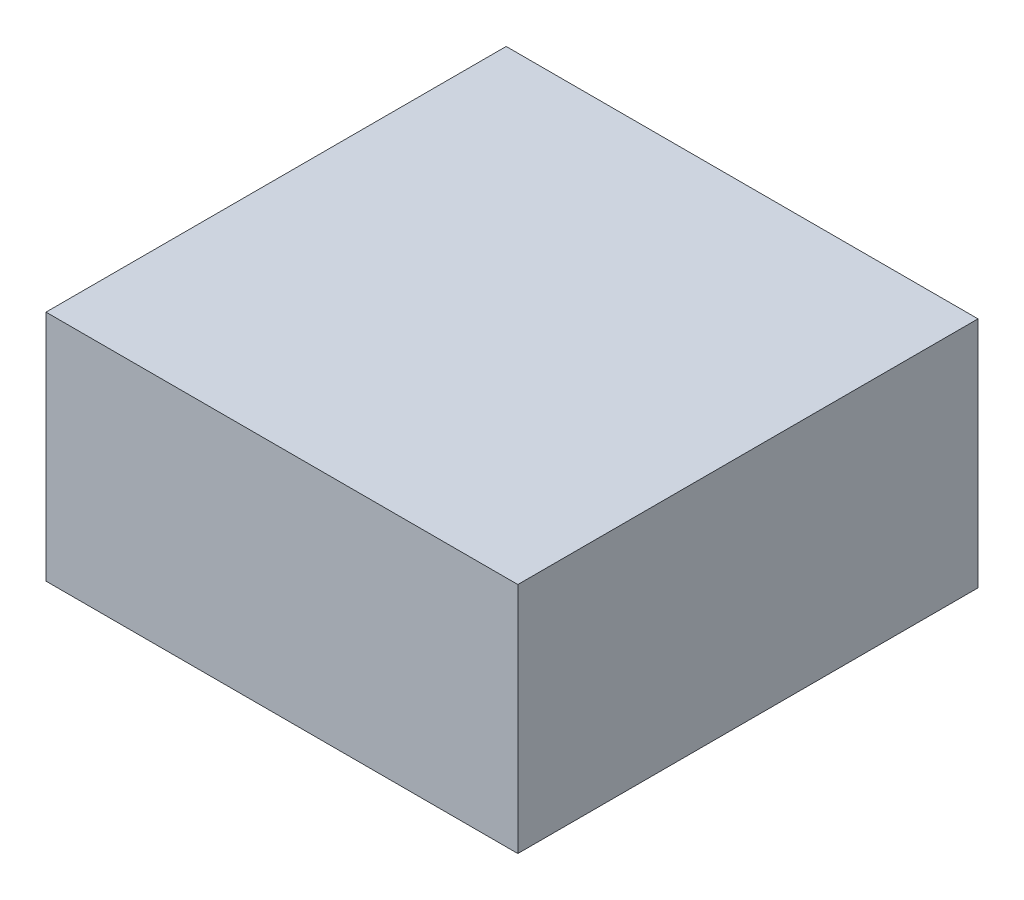
ISO-10303-21;
HEADER;
FILE_DESCRIPTION(('STEP AP214'),'2;1');
FILE_NAME('part.step','',(''),(''),'','','');
FILE_SCHEMA(('AUTOMOTIVE_DESIGN { 1 0 10303 214 1 1 1 1 }'));
ENDSEC;
DATA;
#1=APPLICATION_CONTEXT('core data for automotive mechanical design processes');
#2=APPLICATION_PROTOCOL_DEFINITION('international standard','automotive_design',2000,#1);
#3=PRODUCT_CONTEXT('',#1,'mechanical');
#4=PRODUCT('Part','Part','',(#3));
#5=PRODUCT_RELATED_PRODUCT_CATEGORY('part','',(#4));
#6=PRODUCT_DEFINITION_FORMATION('','',#4);
#7=PRODUCT_DEFINITION_CONTEXT('part definition',#1,'design');
#8=PRODUCT_DEFINITION('design','',#6,#7);
#9=PRODUCT_DEFINITION_SHAPE('','',#8);
#10=(LENGTH_UNIT() NAMED_UNIT(*) SI_UNIT(.MILLI.,.METRE.));
#11=(NAMED_UNIT(*) PLANE_ANGLE_UNIT() SI_UNIT($,.RADIAN.));
#12=(NAMED_UNIT(*) SI_UNIT($,.STERADIAN.) SOLID_ANGLE_UNIT());
#13=UNCERTAINTY_MEASURE_WITH_UNIT(LENGTH_MEASURE(1.E-05),#10,'distance_accuracy_value','');
#14=(GEOMETRIC_REPRESENTATION_CONTEXT(3) GLOBAL_UNCERTAINTY_ASSIGNED_CONTEXT((#13)) GLOBAL_UNIT_ASSIGNED_CONTEXT((#10,
#11,#12)) REPRESENTATION_CONTEXT('',''));
#15=CARTESIAN_POINT('',(0.,0.,0.));
#16=DIRECTION('',(0.,0.,1.));
#17=DIRECTION('',(1.,0.,0.));
#18=AXIS2_PLACEMENT_3D('',#15,#16,#17);
#19=CARTESIAN_POINT('',(-10.,-10.,39.5));
#20=DIRECTION('',(1.,0.,0.));
#21=DIRECTION('',(0.,0.,-1.));
#22=AXIS2_PLACEMENT_3D('',#19,#20,#21);
#23=PLANE('',#22);
#24=DIRECTION('',(0.,-1.,0.));
#25=VECTOR('',#24,1.);
#26=CARTESIAN_POINT('',(-10.,-10.,0.));
#27=LINE('',#26,#25);
#28=CARTESIAN_POINT('',(-10.,10.,0.));
#29=VERTEX_POINT('',#28);
#30=CARTESIAN_POINT('',(-10.,-10.,0.));
#31=VERTEX_POINT('',#30);
#32=EDGE_CURVE('E113',#29,#31,#27,.T.);
#33=ORIENTED_EDGE('',*,*,#32,.T.);
#34=DIRECTION('',(0.,0.,-1.));
#35=VECTOR('',#34,1.);
#36=CARTESIAN_POINT('',(-10.,-10.,39.5));
#37=LINE('',#36,#35);
#38=CARTESIAN_POINT('',(-10.,-10.,39.5));
#39=VERTEX_POINT('',#38);
#40=EDGE_CURVE('E11',#39,#31,#37,.T.);
#41=ORIENTED_EDGE('',*,*,#40,.F.);
#42=DIRECTION('',(0.,-1.,0.));
#43=VECTOR('',#42,1.);
#44=CARTESIAN_POINT('',(-10.,-10.,39.5));
#45=LINE('',#44,#43);
#46=CARTESIAN_POINT('',(-10.,10.,39.5));
#47=VERTEX_POINT('',#46);
#48=EDGE_CURVE('E100',#47,#39,#45,.T.);
#49=ORIENTED_EDGE('',*,*,#48,.F.);
#50=DIRECTION('',(0.,0.,-1.));
#51=VECTOR('',#50,1.);
#52=CARTESIAN_POINT('',(-10.,10.,39.5));
#53=LINE('',#52,#51);
#54=EDGE_CURVE('E112',#47,#29,#53,.T.);
#55=ORIENTED_EDGE('',*,*,#54,.T.);
#56=EDGE_LOOP('',(#33,#41,#49,#55));
#57=FACE_BOUND('',#56,.T.);
#58=ADVANCED_FACE('F44',(#57),#23,.F.);
#59=CARTESIAN_POINT('',(-10.,-10.,39.5));
#60=DIRECTION('',(0.,1.,0.));
#61=DIRECTION('',(0.,0.,1.));
#62=AXIS2_PLACEMENT_3D('',#59,#60,#61);
#63=PLANE('',#62);
#64=DIRECTION('',(1.,0.,0.));
#65=VECTOR('',#64,1.);
#66=CARTESIAN_POINT('',(-10.,-10.,0.));
#67=LINE('',#66,#65);
#68=CARTESIAN_POINT('',(30.5,-10.,0.));
#69=VERTEX_POINT('',#68);
#70=EDGE_CURVE('E105',#31,#69,#67,.T.);
#71=ORIENTED_EDGE('',*,*,#70,.T.);
#72=DIRECTION('',(0.,0.,-1.));
#73=VECTOR('',#72,1.);
#74=CARTESIAN_POINT('',(30.5,-10.,39.5));
#75=LINE('',#74,#73);
#76=CARTESIAN_POINT('',(30.5,-10.,39.5));
#77=VERTEX_POINT('',#76);
#78=EDGE_CURVE('E53',#77,#69,#75,.T.);
#79=ORIENTED_EDGE('',*,*,#78,.F.);
#80=DIRECTION('',(1.,0.,0.));
#81=VECTOR('',#80,1.);
#82=CARTESIAN_POINT('',(-10.,-10.,39.5));
#83=LINE('',#82,#81);
#84=EDGE_CURVE('E95',#39,#77,#83,.T.);
#85=ORIENTED_EDGE('',*,*,#84,.F.);
#86=ORIENTED_EDGE('',*,*,#40,.T.);
#87=EDGE_LOOP('',(#71,#79,#85,#86));
#88=FACE_BOUND('',#87,.T.);
#89=ADVANCED_FACE('F101',(#88),#63,.F.);
#90=CARTESIAN_POINT('',(30.5,-10.,39.5));
#91=DIRECTION('',(-1.,0.,0.));
#92=DIRECTION('',(0.,0.,1.));
#93=AXIS2_PLACEMENT_3D('',#90,#91,#92);
#94=PLANE('',#93);
#95=DIRECTION('',(0.,1.,0.));
#96=VECTOR('',#95,1.);
#97=CARTESIAN_POINT('',(30.5,-10.,0.));
#98=LINE('',#97,#96);
#99=CARTESIAN_POINT('',(30.5,10.,0.));
#100=VERTEX_POINT('',#99);
#101=EDGE_CURVE('E80',#69,#100,#98,.T.);
#102=ORIENTED_EDGE('',*,*,#101,.T.);
#103=DIRECTION('',(0.,0.,-1.));
#104=VECTOR('',#103,1.);
#105=CARTESIAN_POINT('',(30.5,10.,39.5));
#106=LINE('',#105,#104);
#107=CARTESIAN_POINT('',(30.5,10.,39.5));
#108=VERTEX_POINT('',#107);
#109=EDGE_CURVE('E102',#108,#100,#106,.T.);
#110=ORIENTED_EDGE('',*,*,#109,.F.);
#111=DIRECTION('',(0.,1.,0.));
#112=VECTOR('',#111,1.);
#113=CARTESIAN_POINT('',(30.5,-10.,39.5));
#114=LINE('',#113,#112);
#115=EDGE_CURVE('E92',#77,#108,#114,.T.);
#116=ORIENTED_EDGE('',*,*,#115,.F.);
#117=ORIENTED_EDGE('',*,*,#78,.T.);
#118=EDGE_LOOP('',(#102,#110,#116,#117));
#119=FACE_BOUND('',#118,.T.);
#120=ADVANCED_FACE('F104',(#119),#94,.F.);
#121=CARTESIAN_POINT('',(-10.,10.,39.5));
#122=DIRECTION('',(0.,-1.,0.));
#123=DIRECTION('',(0.,0.,-1.));
#124=AXIS2_PLACEMENT_3D('',#121,#122,#123);
#125=PLANE('',#124);
#126=DIRECTION('',(-1.,0.,0.));
#127=VECTOR('',#126,1.);
#128=CARTESIAN_POINT('',(-10.,10.,0.));
#129=LINE('',#128,#127);
#130=EDGE_CURVE('E84',#100,#29,#129,.T.);
#131=ORIENTED_EDGE('',*,*,#130,.T.);
#132=ORIENTED_EDGE('',*,*,#54,.F.);
#133=DIRECTION('',(-1.,0.,0.));
#134=VECTOR('',#133,1.);
#135=CARTESIAN_POINT('',(-10.,10.,39.5));
#136=LINE('',#135,#134);
#137=EDGE_CURVE('E64',#108,#47,#136,.T.);
#138=ORIENTED_EDGE('',*,*,#137,.F.);
#139=ORIENTED_EDGE('',*,*,#109,.T.);
#140=EDGE_LOOP('',(#131,#132,#138,#139));
#141=FACE_BOUND('',#140,.T.);
#142=ADVANCED_FACE('F130',(#141),#125,.F.);
#143=CARTESIAN_POINT('',(0.,0.,39.5));
#144=DIRECTION('',(0.,0.,-1.));
#145=DIRECTION('',(-1.,0.,0.));
#146=AXIS2_PLACEMENT_3D('',#143,#144,#145);
#147=PLANE('',#146);
#148=ORIENTED_EDGE('',*,*,#48,.T.);
#149=ORIENTED_EDGE('',*,*,#84,.T.);
#150=ORIENTED_EDGE('',*,*,#115,.T.);
#151=ORIENTED_EDGE('',*,*,#137,.T.);
#152=EDGE_LOOP('',(#148,#149,#150,#151));
#153=FACE_BOUND('',#152,.T.);
#154=ADVANCED_FACE('F91',(#153),#147,.F.);
#155=CARTESIAN_POINT('',(0.,0.,0.));
#156=DIRECTION('',(0.,0.,-1.));
#157=DIRECTION('',(-1.,0.,0.));
#158=AXIS2_PLACEMENT_3D('',#155,#156,#157);
#159=PLANE('',#158);
#160=ORIENTED_EDGE('',*,*,#32,.F.);
#161=ORIENTED_EDGE('',*,*,#130,.F.);
#162=ORIENTED_EDGE('',*,*,#101,.F.);
#163=ORIENTED_EDGE('',*,*,#70,.F.);
#164=EDGE_LOOP('',(#160,#161,#162,#163));
#165=FACE_BOUND('',#164,.T.);
#166=ADVANCED_FACE('F128',(#165),#159,.T.);
#167=CLOSED_SHELL('',(#58,#89,#120,#142,#154,#166));
#168=MANIFOLD_SOLID_BREP('B2',#167);
#169=ADVANCED_BREP_SHAPE_REPRESENTATION('',(#18,#168),#14);
#170=SHAPE_DEFINITION_REPRESENTATION(#9,#169);
ENDSEC;
END-ISO-10303-21;
